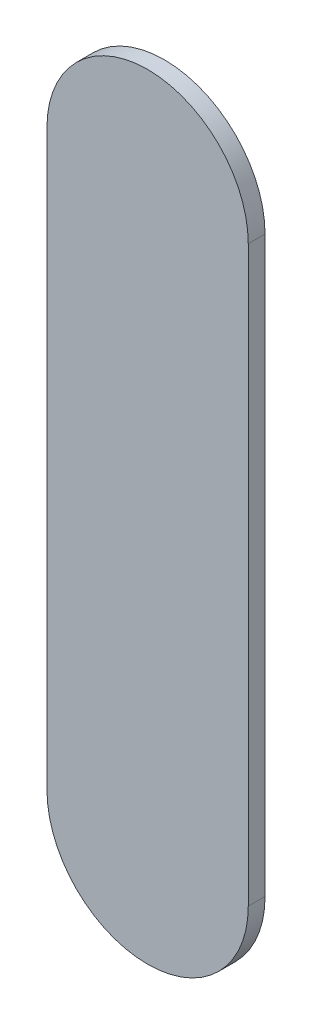
ISO-10303-21;
HEADER;
FILE_DESCRIPTION(('STEP AP214'),'2;1');
FILE_NAME('part.step','',(''),(''),'','','');
FILE_SCHEMA(('AUTOMOTIVE_DESIGN { 1 0 10303 214 1 1 1 1 }'));
ENDSEC;
DATA;
#1=APPLICATION_CONTEXT('core data for automotive mechanical design processes');
#2=APPLICATION_PROTOCOL_DEFINITION('international standard','automotive_design',2000,#1);
#3=PRODUCT_CONTEXT('',#1,'mechanical');
#4=PRODUCT('Part','Part','',(#3));
#5=PRODUCT_RELATED_PRODUCT_CATEGORY('part','',(#4));
#6=PRODUCT_DEFINITION_FORMATION('','',#4);
#7=PRODUCT_DEFINITION_CONTEXT('part definition',#1,'design');
#8=PRODUCT_DEFINITION('design','',#6,#7);
#9=PRODUCT_DEFINITION_SHAPE('','',#8);
#10=(LENGTH_UNIT() NAMED_UNIT(*) SI_UNIT(.MILLI.,.METRE.));
#11=(NAMED_UNIT(*) PLANE_ANGLE_UNIT() SI_UNIT($,.RADIAN.));
#12=(NAMED_UNIT(*) SI_UNIT($,.STERADIAN.) SOLID_ANGLE_UNIT());
#13=UNCERTAINTY_MEASURE_WITH_UNIT(LENGTH_MEASURE(1.E-05),#10,'distance_accuracy_value','');
#14=(GEOMETRIC_REPRESENTATION_CONTEXT(3) GLOBAL_UNCERTAINTY_ASSIGNED_CONTEXT((#13)) GLOBAL_UNIT_ASSIGNED_CONTEXT((#10,
#11,#12)) REPRESENTATION_CONTEXT('',''));
#15=CARTESIAN_POINT('',(0.,0.,0.));
#16=DIRECTION('',(0.,0.,1.));
#17=DIRECTION('',(1.,0.,0.));
#18=AXIS2_PLACEMENT_3D('',#15,#16,#17);
#19=CARTESIAN_POINT('',(37.852999267578,46.530148925781,1.1723000001));
#20=DIRECTION('',(0.,0.,1.));
#21=DIRECTION('',(1.,0.,0.));
#22=AXIS2_PLACEMENT_3D('',#19,#20,#21);
#23=PLANE('',#22);
#24=CARTESIAN_POINT('',(37.852999267578,46.312996826172,1.1723000001));
#25=DIRECTION('',(0.,0.,-1.));
#26=DIRECTION('',(1.,0.,0.));
#27=AXIS2_PLACEMENT_3D('',#24,#25,#26);
#28=CIRCLE('',#27,0.07619995118165);
#29=CARTESIAN_POINT('',(37.92919921875,46.312997436523,1.1723000001));
#30=VERTEX_POINT('',#29);
#31=CARTESIAN_POINT('',(37.776799316401,46.312996826172,1.1723000001));
#32=VERTEX_POINT('',#31);
#33=EDGE_CURVE('E101',#30,#32,#28,.T.);
#34=ORIENTED_EDGE('',*,*,#33,.F.);
#35=DIRECTION('',(0.,1.,0.));
#36=VECTOR('',#35,1.);
#37=CARTESIAN_POINT('',(37.92919921875,46.747299804688,1.1723000001));
#38=LINE('',#37,#36);
#39=CARTESIAN_POINT('',(37.929199218755,46.747301025391,1.1723000001));
#40=VERTEX_POINT('',#39);
#41=EDGE_CURVE('E105',#30,#40,#38,.T.);
#42=ORIENTED_EDGE('',*,*,#41,.T.);
#43=CARTESIAN_POINT('',(37.852999267578,46.747301025391,1.1723000001));
#44=DIRECTION('',(0.,0.,-1.));
#45=DIRECTION('',(1.,0.,0.));
#46=AXIS2_PLACEMENT_3D('',#43,#44,#45);
#47=CIRCLE('',#46,0.07619995118165);
#48=CARTESIAN_POINT('',(37.776799316406,46.747300415039,1.1723000001));
#49=VERTEX_POINT('',#48);
#50=EDGE_CURVE('E79',#49,#40,#47,.T.);
#51=ORIENTED_EDGE('',*,*,#50,.F.);
#52=DIRECTION('',(0.,-1.,0.));
#53=VECTOR('',#52,1.);
#54=CARTESIAN_POINT('',(37.776799316406,46.312998046875,1.1723000001));
#55=LINE('',#54,#53);
#56=EDGE_CURVE('E11',#49,#32,#55,.T.);
#57=ORIENTED_EDGE('',*,*,#56,.T.);
#58=EDGE_LOOP('',(#34,#42,#51,#57));
#59=FACE_BOUND('',#58,.T.);
#60=ADVANCED_FACE('F17',(#59),#23,.T.);
#61=CARTESIAN_POINT('',(37.776799316406,46.312998046875,1.1596000001));
#62=DIRECTION('',(1.,0.,0.));
#63=DIRECTION('',(0.,1.,0.));
#64=AXIS2_PLACEMENT_3D('',#61,#62,#63);
#65=PLANE('',#64);
#66=DIRECTION('',(0.,0.,1.));
#67=VECTOR('',#66,1.);
#68=CARTESIAN_POINT('',(37.776799316406,46.747299804688,1.1596000001));
#69=LINE('',#68,#67);
#70=CARTESIAN_POINT('',(37.776799316406,46.747300415039,1.1596000001));
#71=VERTEX_POINT('',#70);
#72=EDGE_CURVE('E90',#71,#49,#69,.T.);
#73=ORIENTED_EDGE('',*,*,#72,.F.);
#74=DIRECTION('',(0.,-1.,0.));
#75=VECTOR('',#74,1.);
#76=CARTESIAN_POINT('',(37.776799316406,46.530148925781,1.1596000001));
#77=LINE('',#76,#75);
#78=CARTESIAN_POINT('',(37.776799316401,46.312996826172,1.1596000001));
#79=VERTEX_POINT('',#78);
#80=EDGE_CURVE('E88',#71,#79,#77,.T.);
#81=ORIENTED_EDGE('',*,*,#80,.T.);
#82=DIRECTION('',(0.,0.,-1.));
#83=VECTOR('',#82,1.);
#84=CARTESIAN_POINT('',(37.776799316396,46.312996826172,1.1596000001));
#85=LINE('',#84,#83);
#86=EDGE_CURVE('E28',#32,#79,#85,.T.);
#87=ORIENTED_EDGE('',*,*,#86,.F.);
#88=ORIENTED_EDGE('',*,*,#56,.F.);
#89=EDGE_LOOP('',(#73,#81,#87,#88));
#90=FACE_BOUND('',#89,.T.);
#91=ADVANCED_FACE('F19',(#90),#65,.F.);
#92=CARTESIAN_POINT('',(37.852999267578,46.312996826172,1.1596000001));
#93=DIRECTION('',(0.,0.,1.));
#94=DIRECTION('',(1.,0.,0.));
#95=AXIS2_PLACEMENT_3D('',#92,#93,#94);
#96=CYLINDRICAL_SURFACE('',#95,0.07619995118165);
#97=DIRECTION('',(0.,0.,1.));
#98=VECTOR('',#97,1.);
#99=CARTESIAN_POINT('',(37.92919921875,46.312998046875,1.1596000001));
#100=LINE('',#99,#98);
#101=CARTESIAN_POINT('',(37.92919921875,46.312997436523,1.1596000001));
#102=VERTEX_POINT('',#101);
#103=EDGE_CURVE('E64',#102,#30,#100,.T.);
#104=ORIENTED_EDGE('',*,*,#103,.T.);
#105=ORIENTED_EDGE('',*,*,#33,.T.);
#106=ORIENTED_EDGE('',*,*,#86,.T.);
#107=CARTESIAN_POINT('',(37.852999267578,46.312996826172,1.1596000001));
#108=DIRECTION('',(0.,0.,1.));
#109=DIRECTION('',(1.,0.,0.));
#110=AXIS2_PLACEMENT_3D('',#107,#108,#109);
#111=CIRCLE('',#110,0.07619995118165);
#112=EDGE_CURVE('E21',#79,#102,#111,.T.);
#113=ORIENTED_EDGE('',*,*,#112,.T.);
#114=EDGE_LOOP('',(#104,#105,#106,#113));
#115=FACE_BOUND('',#114,.T.);
#116=ADVANCED_FACE('F118',(#115),#96,.T.);
#117=CARTESIAN_POINT('',(37.92919921875,46.747299804688,1.1596000001));
#118=DIRECTION('',(-1.,0.,0.));
#119=DIRECTION('',(0.,0.,1.));
#120=AXIS2_PLACEMENT_3D('',#117,#118,#119);
#121=PLANE('',#120);
#122=ORIENTED_EDGE('',*,*,#103,.F.);
#123=DIRECTION('',(0.,1.,0.));
#124=VECTOR('',#123,1.);
#125=CARTESIAN_POINT('',(37.92919921875,46.530148925781,1.1596000001));
#126=LINE('',#125,#124);
#127=CARTESIAN_POINT('',(37.929199218755,46.747301025391,1.1596000001));
#128=VERTEX_POINT('',#127);
#129=EDGE_CURVE('E86',#102,#128,#126,.T.);
#130=ORIENTED_EDGE('',*,*,#129,.T.);
#131=DIRECTION('',(0.,0.,-1.));
#132=VECTOR('',#131,1.);
#133=CARTESIAN_POINT('',(37.92919921876,46.747301025391,1.1596000001));
#134=LINE('',#133,#132);
#135=EDGE_CURVE('E73',#40,#128,#134,.T.);
#136=ORIENTED_EDGE('',*,*,#135,.F.);
#137=ORIENTED_EDGE('',*,*,#41,.F.);
#138=EDGE_LOOP('',(#122,#130,#136,#137));
#139=FACE_BOUND('',#138,.T.);
#140=ADVANCED_FACE('F92',(#139),#121,.F.);
#141=CARTESIAN_POINT('',(37.852999267578,46.747301025391,1.1596000001));
#142=DIRECTION('',(0.,0.,1.));
#143=DIRECTION('',(1.,0.,0.));
#144=AXIS2_PLACEMENT_3D('',#141,#142,#143);
#145=CYLINDRICAL_SURFACE('',#144,0.07619995118165);
#146=ORIENTED_EDGE('',*,*,#72,.T.);
#147=ORIENTED_EDGE('',*,*,#50,.T.);
#148=ORIENTED_EDGE('',*,*,#135,.T.);
#149=CARTESIAN_POINT('',(37.852999267578,46.747301025391,1.1596000001));
#150=DIRECTION('',(0.,0.,1.));
#151=DIRECTION('',(1.,0.,0.));
#152=AXIS2_PLACEMENT_3D('',#149,#150,#151);
#153=CIRCLE('',#152,0.07619995118165);
#154=EDGE_CURVE('E77',#128,#71,#153,.T.);
#155=ORIENTED_EDGE('',*,*,#154,.T.);
#156=EDGE_LOOP('',(#146,#147,#148,#155));
#157=FACE_BOUND('',#156,.T.);
#158=ADVANCED_FACE('F76',(#157),#145,.T.);
#159=CARTESIAN_POINT('',(37.852999267578,46.530148925781,1.1596000001));
#160=DIRECTION('',(0.,0.,1.));
#161=DIRECTION('',(1.,0.,0.));
#162=AXIS2_PLACEMENT_3D('',#159,#160,#161);
#163=PLANE('',#162);
#164=ORIENTED_EDGE('',*,*,#129,.F.);
#165=ORIENTED_EDGE('',*,*,#112,.F.);
#166=ORIENTED_EDGE('',*,*,#80,.F.);
#167=ORIENTED_EDGE('',*,*,#154,.F.);
#168=EDGE_LOOP('',(#164,#165,#166,#167));
#169=FACE_BOUND('',#168,.T.);
#170=ADVANCED_FACE('F84',(#169),#163,.F.);
#171=CLOSED_SHELL('',(#60,#91,#116,#140,#158,#170));
#172=MANIFOLD_SOLID_BREP('B1',#171);
#173=ADVANCED_BREP_SHAPE_REPRESENTATION('',(#18,#172),#14);
#174=SHAPE_DEFINITION_REPRESENTATION(#9,#173);
ENDSEC;
END-ISO-10303-21;
